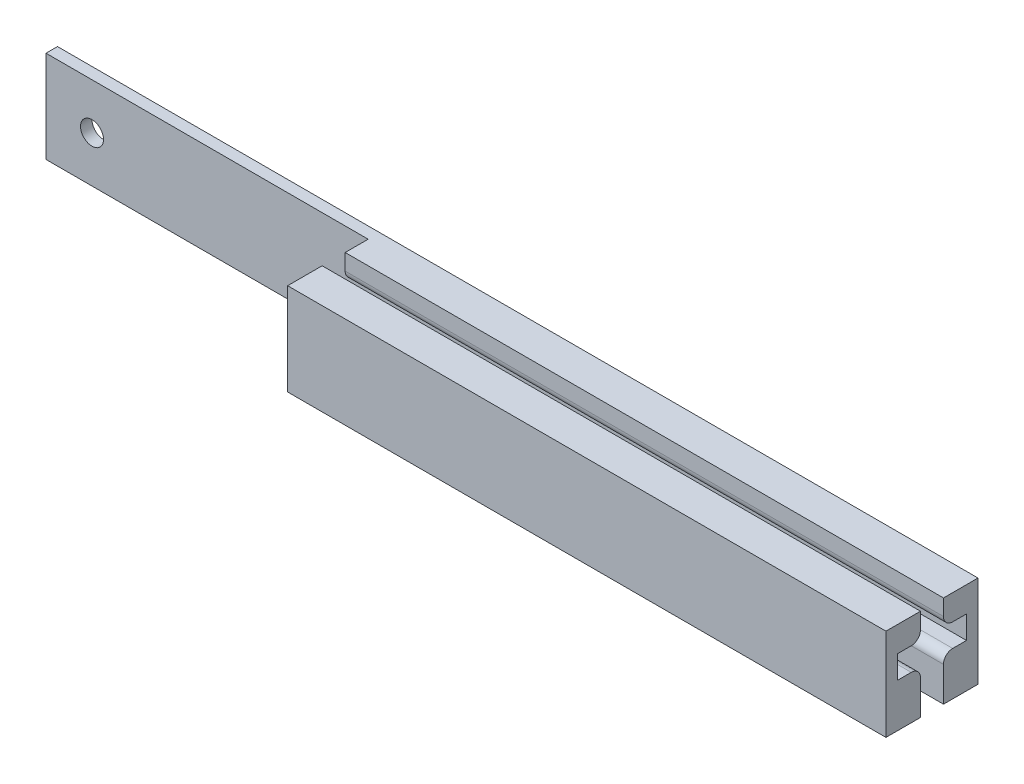
ISO-10303-21;
HEADER;
FILE_DESCRIPTION(('STEP AP214'),'2;1');
FILE_NAME('part.step','',(''),(''),'','','');
FILE_SCHEMA(('AUTOMOTIVE_DESIGN { 1 0 10303 214 1 1 1 1 }'));
ENDSEC;
DATA;
#1=APPLICATION_CONTEXT('core data for automotive mechanical design processes');
#2=APPLICATION_PROTOCOL_DEFINITION('international standard','automotive_design',2000,#1);
#3=PRODUCT_CONTEXT('',#1,'mechanical');
#4=PRODUCT('Part','Part','',(#3));
#5=PRODUCT_RELATED_PRODUCT_CATEGORY('part','',(#4));
#6=PRODUCT_DEFINITION_FORMATION('','',#4);
#7=PRODUCT_DEFINITION_CONTEXT('part definition',#1,'design');
#8=PRODUCT_DEFINITION('design','',#6,#7);
#9=PRODUCT_DEFINITION_SHAPE('','',#8);
#10=(LENGTH_UNIT() NAMED_UNIT(*) SI_UNIT(.MILLI.,.METRE.));
#11=(NAMED_UNIT(*) PLANE_ANGLE_UNIT() SI_UNIT($,.RADIAN.));
#12=(NAMED_UNIT(*) SI_UNIT($,.STERADIAN.) SOLID_ANGLE_UNIT());
#13=UNCERTAINTY_MEASURE_WITH_UNIT(LENGTH_MEASURE(1.E-05),#10,'distance_accuracy_value','');
#14=(GEOMETRIC_REPRESENTATION_CONTEXT(3) GLOBAL_UNCERTAINTY_ASSIGNED_CONTEXT((#13)) GLOBAL_UNIT_ASSIGNED_CONTEXT((#10,
#11,#12)) REPRESENTATION_CONTEXT('',''));
#15=CARTESIAN_POINT('',(0.,0.,0.));
#16=DIRECTION('',(0.,0.,1.));
#17=DIRECTION('',(1.,0.,0.));
#18=AXIS2_PLACEMENT_3D('',#15,#16,#17);
#19=CARTESIAN_POINT('',(0.,0.,0.));
#20=DIRECTION('',(1.,0.,0.));
#21=DIRECTION('',(0.,0.,-1.));
#22=AXIS2_PLACEMENT_3D('',#19,#20,#21);
#23=PLANE('',#22);
#24=DIRECTION('',(0.,1.,0.));
#25=VECTOR('',#24,1.);
#26=CARTESIAN_POINT('',(0.,0.,12.5));
#27=LINE('',#26,#25);
#28=CARTESIAN_POINT('',(0.,0.,12.5));
#29=VERTEX_POINT('',#28);
#30=CARTESIAN_POINT('',(0.,47.5,12.5));
#31=VERTEX_POINT('',#30);
#32=EDGE_CURVE('E52',#29,#31,#27,.T.);
#33=ORIENTED_EDGE('',*,*,#32,.F.);
#34=DIRECTION('',(0.,0.,1.));
#35=VECTOR('',#34,1.);
#36=CARTESIAN_POINT('',(0.,0.,0.));
#37=LINE('',#36,#35);
#38=CARTESIAN_POINT('',(0.,0.,100.));
#39=VERTEX_POINT('',#38);
#40=EDGE_CURVE('E238',#29,#39,#37,.T.);
#41=ORIENTED_EDGE('',*,*,#40,.T.);
#42=DIRECTION('',(0.,1.,0.));
#43=VECTOR('',#42,1.);
#44=CARTESIAN_POINT('',(0.,0.,100.));
#45=LINE('',#44,#43);
#46=CARTESIAN_POINT('',(0.,100.,100.));
#47=VERTEX_POINT('',#46);
#48=EDGE_CURVE('E340',#39,#47,#45,.T.);
#49=ORIENTED_EDGE('',*,*,#48,.T.);
#50=DIRECTION('',(0.,0.,1.));
#51=VECTOR('',#50,1.);
#52=CARTESIAN_POINT('',(0.,100.,0.));
#53=LINE('',#52,#51);
#54=CARTESIAN_POINT('',(0.,100.,62.5));
#55=VERTEX_POINT('',#54);
#56=EDGE_CURVE('E336',#55,#47,#53,.T.);
#57=ORIENTED_EDGE('',*,*,#56,.F.);
#58=DIRECTION('',(0.,-1.,0.));
#59=VECTOR('',#58,1.);
#60=CARTESIAN_POINT('',(0.,0.,62.5));
#61=LINE('',#60,#59);
#62=CARTESIAN_POINT('',(0.,82.5,62.5));
#63=VERTEX_POINT('',#62);
#64=EDGE_CURVE('E327',#55,#63,#61,.T.);
#65=ORIENTED_EDGE('',*,*,#64,.T.);
#66=CARTESIAN_POINT('',(0.,82.5,72.5));
#67=DIRECTION('',(1.,0.,0.));
#68=DIRECTION('',(0.,0.,-1.));
#69=AXIS2_PLACEMENT_3D('',#66,#67,#68);
#70=CIRCLE('',#69,10.);
#71=CARTESIAN_POINT('',(0.,72.5,72.5));
#72=VERTEX_POINT('',#71);
#73=EDGE_CURVE('E367',#63,#72,#70,.F.);
#74=ORIENTED_EDGE('',*,*,#73,.T.);
#75=DIRECTION('',(0.,0.,-1.));
#76=VECTOR('',#75,1.);
#77=CARTESIAN_POINT('',(0.,72.5,0.));
#78=LINE('',#77,#76);
#79=CARTESIAN_POINT('',(0.,72.5,87.5));
#80=VERTEX_POINT('',#79);
#81=EDGE_CURVE('E333',#80,#72,#78,.T.);
#82=ORIENTED_EDGE('',*,*,#81,.F.);
#83=DIRECTION('',(0.,-1.,0.));
#84=VECTOR('',#83,1.);
#85=CARTESIAN_POINT('',(0.,0.,87.5));
#86=LINE('',#85,#84);
#87=CARTESIAN_POINT('',(0.,47.5,87.5));
#88=VERTEX_POINT('',#87);
#89=EDGE_CURVE('E330',#80,#88,#86,.T.);
#90=ORIENTED_EDGE('',*,*,#89,.T.);
#91=DIRECTION('',(0.,0.,-1.));
#92=VECTOR('',#91,1.);
#93=CARTESIAN_POINT('',(0.,47.5,0.));
#94=LINE('',#93,#92);
#95=CARTESIAN_POINT('',(0.,47.5,72.5));
#96=VERTEX_POINT('',#95);
#97=EDGE_CURVE('E326',#88,#96,#94,.T.);
#98=ORIENTED_EDGE('',*,*,#97,.T.);
#99=CARTESIAN_POINT('',(0.,37.5,72.5));
#100=DIRECTION('',(1.,0.,0.));
#101=DIRECTION('',(0.,0.,-1.));
#102=AXIS2_PLACEMENT_3D('',#99,#100,#101);
#103=CIRCLE('',#102,10.);
#104=CARTESIAN_POINT('',(0.,37.5,62.5));
#105=VERTEX_POINT('',#104);
#106=EDGE_CURVE('E369',#96,#105,#103,.F.);
#107=ORIENTED_EDGE('',*,*,#106,.T.);
#108=CARTESIAN_POINT('',(0.,20.,62.5));
#109=VERTEX_POINT('',#108);
#110=EDGE_CURVE('E324',#105,#109,#61,.T.);
#111=ORIENTED_EDGE('',*,*,#110,.T.);
#112=DIRECTION('',(0.,0.,-1.));
#113=VECTOR('',#112,1.);
#114=CARTESIAN_POINT('',(0.,20.,0.));
#115=LINE('',#114,#113);
#116=CARTESIAN_POINT('',(0.,20.,37.5));
#117=VERTEX_POINT('',#116);
#118=EDGE_CURVE('E321',#109,#117,#115,.T.);
#119=ORIENTED_EDGE('',*,*,#118,.T.);
#120=DIRECTION('',(0.,-1.,0.));
#121=VECTOR('',#120,1.);
#122=CARTESIAN_POINT('',(0.,0.,37.5));
#123=LINE('',#122,#121);
#124=CARTESIAN_POINT('',(0.,37.5,37.5));
#125=VERTEX_POINT('',#124);
#126=EDGE_CURVE('E260',#125,#117,#123,.T.);
#127=ORIENTED_EDGE('',*,*,#126,.F.);
#128=CARTESIAN_POINT('',(0.,37.5,27.5));
#129=DIRECTION('',(1.,0.,0.));
#130=DIRECTION('',(0.,0.,-1.));
#131=AXIS2_PLACEMENT_3D('',#128,#129,#130);
#132=CIRCLE('',#131,10.);
#133=CARTESIAN_POINT('',(0.,47.5,27.5));
#134=VERTEX_POINT('',#133);
#135=EDGE_CURVE('E373',#125,#134,#132,.F.);
#136=ORIENTED_EDGE('',*,*,#135,.T.);
#137=DIRECTION('',(0.,0.,-1.));
#138=VECTOR('',#137,1.);
#139=CARTESIAN_POINT('',(0.,47.5,0.));
#140=LINE('',#139,#138);
#141=EDGE_CURVE('E248',#134,#31,#140,.T.);
#142=ORIENTED_EDGE('',*,*,#141,.T.);
#143=EDGE_LOOP('',(#33,#41,#49,#57,#65,#74,#82,#90,#98,#107,#111,#119,#127,#136,#142));
#144=FACE_BOUND('',#143,.T.);
#145=ADVANCED_FACE('F35',(#144),#23,.F.);
#146=CARTESIAN_POINT('',(0.,72.5,12.5));
#147=VERTEX_POINT('',#146);
#148=CARTESIAN_POINT('',(0.,100.,12.5));
#149=VERTEX_POINT('',#148);
#150=EDGE_CURVE('E11',#147,#149,#27,.T.);
#151=ORIENTED_EDGE('',*,*,#150,.F.);
#152=DIRECTION('',(0.,0.,-1.));
#153=VECTOR('',#152,1.);
#154=CARTESIAN_POINT('',(0.,72.5,0.));
#155=LINE('',#154,#153);
#156=CARTESIAN_POINT('',(0.,72.5,27.5));
#157=VERTEX_POINT('',#156);
#158=EDGE_CURVE('E245',#157,#147,#155,.T.);
#159=ORIENTED_EDGE('',*,*,#158,.F.);
#160=CARTESIAN_POINT('',(0.,82.5,27.5));
#161=DIRECTION('',(1.,0.,0.));
#162=DIRECTION('',(0.,0.,-1.));
#163=AXIS2_PLACEMENT_3D('',#160,#161,#162);
#164=CIRCLE('',#163,10.);
#165=CARTESIAN_POINT('',(0.,82.5,37.5));
#166=VERTEX_POINT('',#165);
#167=EDGE_CURVE('E371',#157,#166,#164,.F.);
#168=ORIENTED_EDGE('',*,*,#167,.T.);
#169=CARTESIAN_POINT('',(0.,100.,37.5));
#170=VERTEX_POINT('',#169);
#171=EDGE_CURVE('E290',#170,#166,#123,.T.);
#172=ORIENTED_EDGE('',*,*,#171,.F.);
#173=EDGE_CURVE('E341',#149,#170,#53,.T.);
#174=ORIENTED_EDGE('',*,*,#173,.F.);
#175=EDGE_LOOP('',(#151,#159,#168,#172,#174));
#176=FACE_BOUND('',#175,.T.);
#177=ADVANCED_FACE('F490',(#176),#23,.F.);
#178=CARTESIAN_POINT('',(650.,0.,0.));
#179=DIRECTION('',(1.,0.,0.));
#180=DIRECTION('',(0.,0.,-1.));
#181=AXIS2_PLACEMENT_3D('',#178,#179,#180);
#182=PLANE('',#181);
#183=DIRECTION('',(0.,0.,-1.));
#184=VECTOR('',#183,1.);
#185=CARTESIAN_POINT('',(650.,72.5,0.));
#186=LINE('',#185,#184);
#187=CARTESIAN_POINT('',(650.,72.5,87.5));
#188=VERTEX_POINT('',#187);
#189=CARTESIAN_POINT('',(650.,72.5,72.5));
#190=VERTEX_POINT('',#189);
#191=EDGE_CURVE('E307',#188,#190,#186,.T.);
#192=ORIENTED_EDGE('',*,*,#191,.T.);
#193=CARTESIAN_POINT('',(650.,82.5,72.5));
#194=DIRECTION('',(1.,0.,0.));
#195=DIRECTION('',(0.,0.,-1.));
#196=AXIS2_PLACEMENT_3D('',#193,#194,#195);
#197=CIRCLE('',#196,10.);
#198=CARTESIAN_POINT('',(650.,82.5,62.5));
#199=VERTEX_POINT('',#198);
#200=EDGE_CURVE('E361',#190,#199,#197,.T.);
#201=ORIENTED_EDGE('',*,*,#200,.T.);
#202=DIRECTION('',(0.,-1.,0.));
#203=VECTOR('',#202,1.);
#204=CARTESIAN_POINT('',(650.,0.,62.5));
#205=LINE('',#204,#203);
#206=CARTESIAN_POINT('',(650.,100.,62.5));
#207=VERTEX_POINT('',#206);
#208=EDGE_CURVE('E301',#207,#199,#205,.T.);
#209=ORIENTED_EDGE('',*,*,#208,.F.);
#210=DIRECTION('',(0.,0.,1.));
#211=VECTOR('',#210,1.);
#212=CARTESIAN_POINT('',(650.,100.,0.));
#213=LINE('',#212,#211);
#214=CARTESIAN_POINT('',(650.,100.,100.));
#215=VERTEX_POINT('',#214);
#216=EDGE_CURVE('E310',#207,#215,#213,.T.);
#217=ORIENTED_EDGE('',*,*,#216,.T.);
#218=DIRECTION('',(0.,1.,0.));
#219=VECTOR('',#218,1.);
#220=CARTESIAN_POINT('',(650.,0.,100.));
#221=LINE('',#220,#219);
#222=CARTESIAN_POINT('',(650.,0.,100.));
#223=VERTEX_POINT('',#222);
#224=EDGE_CURVE('E312',#223,#215,#221,.T.);
#225=ORIENTED_EDGE('',*,*,#224,.F.);
#226=DIRECTION('',(0.,0.,1.));
#227=VECTOR('',#226,1.);
#228=CARTESIAN_POINT('',(650.,0.,0.));
#229=LINE('',#228,#227);
#230=CARTESIAN_POINT('',(650.,0.,62.5));
#231=VERTEX_POINT('',#230);
#232=EDGE_CURVE('E316',#231,#223,#229,.T.);
#233=ORIENTED_EDGE('',*,*,#232,.F.);
#234=CARTESIAN_POINT('',(650.,37.5,62.5));
#235=VERTEX_POINT('',#234);
#236=EDGE_CURVE('E297',#235,#231,#205,.T.);
#237=ORIENTED_EDGE('',*,*,#236,.F.);
#238=CARTESIAN_POINT('',(650.,37.5,72.5));
#239=DIRECTION('',(1.,0.,0.));
#240=DIRECTION('',(0.,0.,-1.));
#241=AXIS2_PLACEMENT_3D('',#238,#239,#240);
#242=CIRCLE('',#241,10.);
#243=CARTESIAN_POINT('',(650.,47.5,72.5));
#244=VERTEX_POINT('',#243);
#245=EDGE_CURVE('E363',#235,#244,#242,.T.);
#246=ORIENTED_EDGE('',*,*,#245,.T.);
#247=DIRECTION('',(0.,0.,-1.));
#248=VECTOR('',#247,1.);
#249=CARTESIAN_POINT('',(650.,47.5,0.));
#250=LINE('',#249,#248);
#251=CARTESIAN_POINT('',(650.,47.5,87.5));
#252=VERTEX_POINT('',#251);
#253=EDGE_CURVE('E300',#252,#244,#250,.T.);
#254=ORIENTED_EDGE('',*,*,#253,.F.);
#255=DIRECTION('',(0.,-1.,0.));
#256=VECTOR('',#255,1.);
#257=CARTESIAN_POINT('',(650.,0.,87.5));
#258=LINE('',#257,#256);
#259=EDGE_CURVE('E304',#188,#252,#258,.T.);
#260=ORIENTED_EDGE('',*,*,#259,.F.);
#261=EDGE_LOOP('',(#192,#201,#209,#217,#225,#233,#237,#246,#254,#260));
#262=FACE_BOUND('',#261,.T.);
#263=ADVANCED_FACE('F445',(#262),#182,.T.);
#264=CARTESIAN_POINT('',(650.,72.5,0.));
#265=DIRECTION('',(0.,1.,0.));
#266=DIRECTION('',(0.,0.,1.));
#267=AXIS2_PLACEMENT_3D('',#264,#265,#266);
#268=PLANE('',#267);
#269=DIRECTION('',(0.,0.,-1.));
#270=VECTOR('',#269,1.);
#271=CARTESIAN_POINT('',(650.,72.5,0.));
#272=LINE('',#271,#270);
#273=CARTESIAN_POINT('',(650.,72.5,27.5));
#274=VERTEX_POINT('',#273);
#275=CARTESIAN_POINT('',(650.,72.5,12.5));
#276=VERTEX_POINT('',#275);
#277=EDGE_CURVE('E287',#274,#276,#272,.T.);
#278=ORIENTED_EDGE('',*,*,#277,.F.);
#279=DIRECTION('',(-1.,0.,0.));
#280=VECTOR('',#279,1.);
#281=CARTESIAN_POINT('',(650.,72.5,27.5));
#282=LINE('',#281,#280);
#283=EDGE_CURVE('E353',#274,#157,#282,.T.);
#284=ORIENTED_EDGE('',*,*,#283,.T.);
#285=ORIENTED_EDGE('',*,*,#158,.T.);
#286=DIRECTION('',(-1.,0.,0.));
#287=VECTOR('',#286,1.);
#288=CARTESIAN_POINT('',(650.,72.5,12.5));
#289=LINE('',#288,#287);
#290=EDGE_CURVE('E252',#276,#147,#289,.T.);
#291=ORIENTED_EDGE('',*,*,#290,.F.);
#292=EDGE_LOOP('',(#278,#284,#285,#291));
#293=FACE_BOUND('',#292,.T.);
#294=ADVANCED_FACE('F417',(#293),#268,.F.);
#295=CARTESIAN_POINT('',(650.,0.,12.5));
#296=DIRECTION('',(0.,0.,-1.));
#297=DIRECTION('',(0.,1.,0.));
#298=AXIS2_PLACEMENT_3D('',#295,#296,#297);
#299=PLANE('',#298);
#300=CARTESIAN_POINT('',(-300.,50.,12.5));
#301=DIRECTION('',(0.,0.,1.));
#302=DIRECTION('',(1.,0.,0.));
#303=AXIS2_PLACEMENT_3D('',#300,#301,#302);
#304=CIRCLE('',#303,12.5);
#305=CARTESIAN_POINT('',(-287.5,50.,12.5));
#306=VERTEX_POINT('',#305);
#307=EDGE_CURVE('E228',#306,#306,#304,.T.);
#308=ORIENTED_EDGE('',*,*,#307,.F.);
#309=EDGE_LOOP('',(#308));
#310=FACE_BOUND('',#309,.T.);
#311=ORIENTED_EDGE('',*,*,#290,.T.);
#312=ORIENTED_EDGE('',*,*,#150,.T.);
#313=DIRECTION('',(1.,0.,0.));
#314=VECTOR('',#313,1.);
#315=CARTESIAN_POINT('',(-350.,100.,12.5));
#316=LINE('',#315,#314);
#317=CARTESIAN_POINT('',(-350.,100.,12.5));
#318=VERTEX_POINT('',#317);
#319=EDGE_CURVE('E232',#318,#149,#316,.T.);
#320=ORIENTED_EDGE('',*,*,#319,.F.);
#321=DIRECTION('',(0.,1.,0.));
#322=VECTOR('',#321,1.);
#323=CARTESIAN_POINT('',(-350.,0.,12.5));
#324=LINE('',#323,#322);
#325=CARTESIAN_POINT('',(-350.,0.,12.5));
#326=VERTEX_POINT('',#325);
#327=EDGE_CURVE('E219',#326,#318,#324,.T.);
#328=ORIENTED_EDGE('',*,*,#327,.F.);
#329=DIRECTION('',(1.,0.,0.));
#330=VECTOR('',#329,1.);
#331=CARTESIAN_POINT('',(-350.,0.,12.5));
#332=LINE('',#331,#330);
#333=EDGE_CURVE('E216',#326,#29,#332,.T.);
#334=ORIENTED_EDGE('',*,*,#333,.T.);
#335=ORIENTED_EDGE('',*,*,#32,.T.);
#336=DIRECTION('',(-1.,0.,0.));
#337=VECTOR('',#336,1.);
#338=CARTESIAN_POINT('',(650.,47.5,12.5));
#339=LINE('',#338,#337);
#340=CARTESIAN_POINT('',(650.,47.5,12.5));
#341=VERTEX_POINT('',#340);
#342=EDGE_CURVE('E256',#341,#31,#339,.T.);
#343=ORIENTED_EDGE('',*,*,#342,.F.);
#344=DIRECTION('',(0.,-1.,0.));
#345=VECTOR('',#344,1.);
#346=CARTESIAN_POINT('',(650.,0.,12.5));
#347=LINE('',#346,#345);
#348=EDGE_CURVE('E289',#276,#341,#347,.T.);
#349=ORIENTED_EDGE('',*,*,#348,.F.);
#350=EDGE_LOOP('',(#311,#312,#320,#328,#334,#335,#343,#349));
#351=FACE_BOUND('',#350,.T.);
#352=ADVANCED_FACE('F419',(#310,#351),#299,.F.);
#353=CARTESIAN_POINT('',(650.,47.5,0.));
#354=DIRECTION('',(0.,1.,0.));
#355=DIRECTION('',(0.,0.,1.));
#356=AXIS2_PLACEMENT_3D('',#353,#354,#355);
#357=PLANE('',#356);
#358=ORIENTED_EDGE('',*,*,#141,.F.);
#359=DIRECTION('',(-1.,0.,0.));
#360=VECTOR('',#359,1.);
#361=CARTESIAN_POINT('',(650.,47.5,27.5));
#362=LINE('',#361,#360);
#363=CARTESIAN_POINT('',(650.,47.5,27.5));
#364=VERTEX_POINT('',#363);
#365=EDGE_CURVE('E44',#134,#364,#362,.F.);
#366=ORIENTED_EDGE('',*,*,#365,.T.);
#367=DIRECTION('',(0.,0.,-1.));
#368=VECTOR('',#367,1.);
#369=CARTESIAN_POINT('',(650.,47.5,0.));
#370=LINE('',#369,#368);
#371=EDGE_CURVE('E293',#364,#341,#370,.T.);
#372=ORIENTED_EDGE('',*,*,#371,.T.);
#373=ORIENTED_EDGE('',*,*,#342,.T.);
#374=EDGE_LOOP('',(#358,#366,#372,#373));
#375=FACE_BOUND('',#374,.T.);
#376=ADVANCED_FACE('F522',(#375),#357,.T.);
#377=CARTESIAN_POINT('',(650.,0.,37.5));
#378=DIRECTION('',(0.,0.,-1.));
#379=DIRECTION('',(0.,1.,0.));
#380=AXIS2_PLACEMENT_3D('',#377,#378,#379);
#381=PLANE('',#380);
#382=DIRECTION('',(0.,-1.,0.));
#383=VECTOR('',#382,1.);
#384=CARTESIAN_POINT('',(650.,0.,37.5));
#385=LINE('',#384,#383);
#386=CARTESIAN_POINT('',(650.,37.5,37.5));
#387=VERTEX_POINT('',#386);
#388=CARTESIAN_POINT('',(650.,0.,37.5));
#389=VERTEX_POINT('',#388);
#390=EDGE_CURVE('E295',#387,#389,#385,.T.);
#391=ORIENTED_EDGE('',*,*,#390,.F.);
#392=DIRECTION('',(-1.,0.,0.));
#393=VECTOR('',#392,1.);
#394=CARTESIAN_POINT('',(0.,37.5,37.5));
#395=LINE('',#394,#393);
#396=EDGE_CURVE('E344',#387,#125,#395,.T.);
#397=ORIENTED_EDGE('',*,*,#396,.T.);
#398=ORIENTED_EDGE('',*,*,#126,.T.);
#399=DIRECTION('',(-1.,0.,0.));
#400=VECTOR('',#399,1.);
#401=CARTESIAN_POINT('',(650.,20.,37.5));
#402=LINE('',#401,#400);
#403=CARTESIAN_POINT('',(50.,20.,37.5));
#404=VERTEX_POINT('',#403);
#405=EDGE_CURVE('E265',#404,#117,#402,.T.);
#406=ORIENTED_EDGE('',*,*,#405,.F.);
#407=DIRECTION('',(0.,-1.,0.));
#408=VECTOR('',#407,1.);
#409=CARTESIAN_POINT('',(50.,800.,37.5000000000001));
#410=LINE('',#409,#408);
#411=CARTESIAN_POINT('',(50.,0.,37.5));
#412=VERTEX_POINT('',#411);
#413=EDGE_CURVE('E282',#404,#412,#410,.T.);
#414=ORIENTED_EDGE('',*,*,#413,.T.);
#415=DIRECTION('',(1.,0.,0.));
#416=VECTOR('',#415,1.);
#417=CARTESIAN_POINT('',(50.,0.,37.5));
#418=LINE('',#417,#416);
#419=EDGE_CURVE('E272',#412,#389,#418,.T.);
#420=ORIENTED_EDGE('',*,*,#419,.T.);
#421=EDGE_LOOP('',(#391,#397,#398,#406,#414,#420));
#422=FACE_BOUND('',#421,.T.);
#423=ADVANCED_FACE('F428',(#422),#381,.F.);
#424=CARTESIAN_POINT('',(650.,20.,0.));
#425=DIRECTION('',(0.,1.,0.));
#426=DIRECTION('',(0.,0.,1.));
#427=AXIS2_PLACEMENT_3D('',#424,#425,#426);
#428=PLANE('',#427);
#429=DIRECTION('',(0.,0.,1.));
#430=VECTOR('',#429,1.);
#431=CARTESIAN_POINT('',(49.9999999999999,20.,-3.33066907387547E-13));
#432=LINE('',#431,#430);
#433=CARTESIAN_POINT('',(50.,20.,62.5));
#434=VERTEX_POINT('',#433);
#435=EDGE_CURVE('E249',#404,#434,#432,.T.);
#436=ORIENTED_EDGE('',*,*,#435,.F.);
#437=ORIENTED_EDGE('',*,*,#405,.T.);
#438=ORIENTED_EDGE('',*,*,#118,.F.);
#439=DIRECTION('',(-1.,0.,0.));
#440=VECTOR('',#439,1.);
#441=CARTESIAN_POINT('',(650.,20.,62.5));
#442=LINE('',#441,#440);
#443=EDGE_CURVE('E379',#434,#109,#442,.T.);
#444=ORIENTED_EDGE('',*,*,#443,.F.);
#445=EDGE_LOOP('',(#436,#437,#438,#444));
#446=FACE_BOUND('',#445,.T.);
#447=ADVANCED_FACE('F435',(#446),#428,.T.);
#448=CARTESIAN_POINT('',(650.,0.,62.5));
#449=DIRECTION('',(0.,0.,-1.));
#450=DIRECTION('',(0.,1.,0.));
#451=AXIS2_PLACEMENT_3D('',#448,#449,#450);
#452=PLANE('',#451);
#453=ORIENTED_EDGE('',*,*,#110,.F.);
#454=DIRECTION('',(-1.,0.,0.));
#455=VECTOR('',#454,1.);
#456=CARTESIAN_POINT('',(650.,37.5,62.5));
#457=LINE('',#456,#455);
#458=EDGE_CURVE('E356',#105,#235,#457,.F.);
#459=ORIENTED_EDGE('',*,*,#458,.T.);
#460=ORIENTED_EDGE('',*,*,#236,.T.);
#461=DIRECTION('',(-1.,0.,0.));
#462=VECTOR('',#461,1.);
#463=CARTESIAN_POINT('',(50.,0.,62.5));
#464=LINE('',#463,#462);
#465=CARTESIAN_POINT('',(50.,0.,62.5));
#466=VERTEX_POINT('',#465);
#467=EDGE_CURVE('E277',#231,#466,#464,.T.);
#468=ORIENTED_EDGE('',*,*,#467,.T.);
#469=DIRECTION('',(0.,-1.,0.));
#470=VECTOR('',#469,1.);
#471=CARTESIAN_POINT('',(50.,800.,62.5000000000001));
#472=LINE('',#471,#470);
#473=EDGE_CURVE('E283',#434,#466,#472,.T.);
#474=ORIENTED_EDGE('',*,*,#473,.F.);
#475=ORIENTED_EDGE('',*,*,#443,.T.);
#476=EDGE_LOOP('',(#453,#459,#460,#468,#474,#475));
#477=FACE_BOUND('',#476,.T.);
#478=ADVANCED_FACE('F439',(#477),#452,.T.);
#479=CARTESIAN_POINT('',(650.,47.5,0.));
#480=DIRECTION('',(0.,1.,0.));
#481=DIRECTION('',(0.,0.,1.));
#482=AXIS2_PLACEMENT_3D('',#479,#480,#481);
#483=PLANE('',#482);
#484=ORIENTED_EDGE('',*,*,#253,.T.);
#485=DIRECTION('',(-1.,0.,0.));
#486=VECTOR('',#485,1.);
#487=CARTESIAN_POINT('',(650.,47.5,72.5));
#488=LINE('',#487,#486);
#489=EDGE_CURVE('E358',#244,#96,#488,.T.);
#490=ORIENTED_EDGE('',*,*,#489,.T.);
#491=ORIENTED_EDGE('',*,*,#97,.F.);
#492=DIRECTION('',(-1.,0.,0.));
#493=VECTOR('',#492,1.);
#494=CARTESIAN_POINT('',(650.,47.5,87.5));
#495=LINE('',#494,#493);
#496=EDGE_CURVE('E382',#252,#88,#495,.T.);
#497=ORIENTED_EDGE('',*,*,#496,.F.);
#498=EDGE_LOOP('',(#484,#490,#491,#497));
#499=FACE_BOUND('',#498,.T.);
#500=ADVANCED_FACE('F476',(#499),#483,.T.);
#501=CARTESIAN_POINT('',(650.,0.,87.5));
#502=DIRECTION('',(0.,0.,-1.));
#503=DIRECTION('',(-1.,0.,0.));
#504=AXIS2_PLACEMENT_3D('',#501,#502,#503);
#505=PLANE('',#504);
#506=ORIENTED_EDGE('',*,*,#89,.F.);
#507=DIRECTION('',(-1.,0.,0.));
#508=VECTOR('',#507,1.);
#509=CARTESIAN_POINT('',(650.,72.5,87.5));
#510=LINE('',#509,#508);
#511=EDGE_CURVE('E384',#188,#80,#510,.T.);
#512=ORIENTED_EDGE('',*,*,#511,.F.);
#513=ORIENTED_EDGE('',*,*,#259,.T.);
#514=ORIENTED_EDGE('',*,*,#496,.T.);
#515=EDGE_LOOP('',(#506,#512,#513,#514));
#516=FACE_BOUND('',#515,.T.);
#517=ADVANCED_FACE('F473',(#516),#505,.T.);
#518=CARTESIAN_POINT('',(650.,72.5,0.));
#519=DIRECTION('',(0.,1.,0.));
#520=DIRECTION('',(0.,0.,1.));
#521=AXIS2_PLACEMENT_3D('',#518,#519,#520);
#522=PLANE('',#521);
#523=ORIENTED_EDGE('',*,*,#81,.T.);
#524=DIRECTION('',(-1.,0.,0.));
#525=VECTOR('',#524,1.);
#526=CARTESIAN_POINT('',(650.,72.5,72.5));
#527=LINE('',#526,#525);
#528=EDGE_CURVE('E365',#72,#190,#527,.F.);
#529=ORIENTED_EDGE('',*,*,#528,.T.);
#530=ORIENTED_EDGE('',*,*,#191,.F.);
#531=ORIENTED_EDGE('',*,*,#511,.T.);
#532=EDGE_LOOP('',(#523,#529,#530,#531));
#533=FACE_BOUND('',#532,.T.);
#534=ADVANCED_FACE('F469',(#533),#522,.F.);
#535=ORIENTED_EDGE('',*,*,#208,.T.);
#536=DIRECTION('',(-1.,0.,0.));
#537=VECTOR('',#536,1.);
#538=CARTESIAN_POINT('',(0.,82.5,62.5));
#539=LINE('',#538,#537);
#540=EDGE_CURVE('E255',#199,#63,#539,.T.);
#541=ORIENTED_EDGE('',*,*,#540,.T.);
#542=ORIENTED_EDGE('',*,*,#64,.F.);
#543=DIRECTION('',(-1.,0.,0.));
#544=VECTOR('',#543,1.);
#545=CARTESIAN_POINT('',(650.,100.,62.5));
#546=LINE('',#545,#544);
#547=EDGE_CURVE('E386',#207,#55,#546,.T.);
#548=ORIENTED_EDGE('',*,*,#547,.F.);
#549=EDGE_LOOP('',(#535,#541,#542,#548));
#550=FACE_BOUND('',#549,.T.);
#551=ADVANCED_FACE('F460',(#550),#452,.T.);
#552=CARTESIAN_POINT('',(650.,100.,0.));
#553=DIRECTION('',(0.,-1.,0.));
#554=DIRECTION('',(0.,0.,-1.));
#555=AXIS2_PLACEMENT_3D('',#552,#553,#554);
#556=PLANE('',#555);
#557=ORIENTED_EDGE('',*,*,#56,.T.);
#558=DIRECTION('',(-1.,0.,0.));
#559=VECTOR('',#558,1.);
#560=CARTESIAN_POINT('',(650.,100.,100.));
#561=LINE('',#560,#559);
#562=EDGE_CURVE('E388',#215,#47,#561,.T.);
#563=ORIENTED_EDGE('',*,*,#562,.F.);
#564=ORIENTED_EDGE('',*,*,#216,.F.);
#565=ORIENTED_EDGE('',*,*,#547,.T.);
#566=EDGE_LOOP('',(#557,#563,#564,#565));
#567=FACE_BOUND('',#566,.T.);
#568=ADVANCED_FACE('F504',(#567),#556,.F.);
#569=CARTESIAN_POINT('',(650.,0.,100.));
#570=DIRECTION('',(0.,0.,1.));
#571=DIRECTION('',(1.,0.,0.));
#572=AXIS2_PLACEMENT_3D('',#569,#570,#571);
#573=PLANE('',#572);
#574=ORIENTED_EDGE('',*,*,#48,.F.);
#575=DIRECTION('',(-1.,0.,0.));
#576=VECTOR('',#575,1.);
#577=CARTESIAN_POINT('',(650.,0.,100.));
#578=LINE('',#577,#576);
#579=EDGE_CURVE('E208',#223,#39,#578,.T.);
#580=ORIENTED_EDGE('',*,*,#579,.F.);
#581=ORIENTED_EDGE('',*,*,#224,.T.);
#582=ORIENTED_EDGE('',*,*,#562,.T.);
#583=EDGE_LOOP('',(#574,#580,#581,#582));
#584=FACE_BOUND('',#583,.T.);
#585=ADVANCED_FACE('F452',(#584),#573,.T.);
#586=CARTESIAN_POINT('',(650.,0.,0.));
#587=DIRECTION('',(0.,-1.,0.));
#588=DIRECTION('',(0.,0.,-1.));
#589=AXIS2_PLACEMENT_3D('',#586,#587,#588);
#590=PLANE('',#589);
#591=ORIENTED_EDGE('',*,*,#467,.F.);
#592=ORIENTED_EDGE('',*,*,#232,.T.);
#593=ORIENTED_EDGE('',*,*,#579,.T.);
#594=ORIENTED_EDGE('',*,*,#40,.F.);
#595=ORIENTED_EDGE('',*,*,#333,.F.);
#596=DIRECTION('',(0.,0.,1.));
#597=VECTOR('',#596,1.);
#598=CARTESIAN_POINT('',(-350.,0.,0.));
#599=LINE('',#598,#597);
#600=CARTESIAN_POINT('',(-350.,0.,0.));
#601=VERTEX_POINT('',#600);
#602=EDGE_CURVE('E212',#601,#326,#599,.T.);
#603=ORIENTED_EDGE('',*,*,#602,.F.);
#604=DIRECTION('',(-1.,0.,0.));
#605=VECTOR('',#604,1.);
#606=CARTESIAN_POINT('',(650.,0.,0.));
#607=LINE('',#606,#605);
#608=CARTESIAN_POINT('',(650.,0.,0.));
#609=VERTEX_POINT('',#608);
#610=EDGE_CURVE('E198',#609,#601,#607,.T.);
#611=ORIENTED_EDGE('',*,*,#610,.F.);
#612=EDGE_CURVE('E317',#609,#389,#229,.T.);
#613=ORIENTED_EDGE('',*,*,#612,.T.);
#614=ORIENTED_EDGE('',*,*,#419,.F.);
#615=DIRECTION('',(0.,0.,-1.));
#616=VECTOR('',#615,1.);
#617=CARTESIAN_POINT('',(50.,0.,62.5));
#618=LINE('',#617,#616);
#619=EDGE_CURVE('E268',#466,#412,#618,.T.);
#620=ORIENTED_EDGE('',*,*,#619,.F.);
#621=EDGE_LOOP('',(#591,#592,#593,#594,#595,#603,#611,#613,#614,#620));
#622=FACE_BOUND('',#621,.T.);
#623=ADVANCED_FACE('F214',(#622),#590,.T.);
#624=CARTESIAN_POINT('',(650.,0.,0.));
#625=DIRECTION('',(0.,0.,1.));
#626=DIRECTION('',(1.,0.,0.));
#627=AXIS2_PLACEMENT_3D('',#624,#625,#626);
#628=PLANE('',#627);
#629=CARTESIAN_POINT('',(-300.,50.,0.));
#630=DIRECTION('',(0.,0.,1.));
#631=DIRECTION('',(1.,0.,0.));
#632=AXIS2_PLACEMENT_3D('',#629,#630,#631);
#633=CIRCLE('',#632,12.5);
#634=CARTESIAN_POINT('',(-287.5,50.,0.));
#635=VERTEX_POINT('',#634);
#636=EDGE_CURVE('E39',#635,#635,#633,.T.);
#637=ORIENTED_EDGE('',*,*,#636,.T.);
#638=EDGE_LOOP('',(#637));
#639=FACE_BOUND('',#638,.T.);
#640=ORIENTED_EDGE('',*,*,#610,.T.);
#641=DIRECTION('',(0.,-1.,0.));
#642=VECTOR('',#641,1.);
#643=CARTESIAN_POINT('',(-350.,0.,0.));
#644=LINE('',#643,#642);
#645=CARTESIAN_POINT('',(-350.,100.,0.));
#646=VERTEX_POINT('',#645);
#647=EDGE_CURVE('E203',#646,#601,#644,.T.);
#648=ORIENTED_EDGE('',*,*,#647,.F.);
#649=DIRECTION('',(-1.,0.,0.));
#650=VECTOR('',#649,1.);
#651=CARTESIAN_POINT('',(650.,100.,0.));
#652=LINE('',#651,#650);
#653=CARTESIAN_POINT('',(650.,100.,0.));
#654=VERTEX_POINT('',#653);
#655=EDGE_CURVE('E209',#654,#646,#652,.T.);
#656=ORIENTED_EDGE('',*,*,#655,.F.);
#657=DIRECTION('',(0.,1.,0.));
#658=VECTOR('',#657,1.);
#659=CARTESIAN_POINT('',(650.,0.,0.));
#660=LINE('',#659,#658);
#661=EDGE_CURVE('E204',#609,#654,#660,.T.);
#662=ORIENTED_EDGE('',*,*,#661,.F.);
#663=EDGE_LOOP('',(#640,#648,#656,#662));
#664=FACE_BOUND('',#663,.T.);
#665=ADVANCED_FACE('F200',(#639,#664),#628,.F.);
#666=ORIENTED_EDGE('',*,*,#655,.T.);
#667=DIRECTION('',(0.,0.,-1.));
#668=VECTOR('',#667,1.);
#669=CARTESIAN_POINT('',(-350.,100.,0.));
#670=LINE('',#669,#668);
#671=EDGE_CURVE('E224',#318,#646,#670,.T.);
#672=ORIENTED_EDGE('',*,*,#671,.F.);
#673=ORIENTED_EDGE('',*,*,#319,.T.);
#674=ORIENTED_EDGE('',*,*,#173,.T.);
#675=DIRECTION('',(-1.,0.,0.));
#676=VECTOR('',#675,1.);
#677=CARTESIAN_POINT('',(650.,100.,37.5));
#678=LINE('',#677,#676);
#679=CARTESIAN_POINT('',(650.,100.,37.5));
#680=VERTEX_POINT('',#679);
#681=EDGE_CURVE('E393',#680,#170,#678,.T.);
#682=ORIENTED_EDGE('',*,*,#681,.F.);
#683=EDGE_CURVE('E313',#654,#680,#213,.T.);
#684=ORIENTED_EDGE('',*,*,#683,.F.);
#685=EDGE_LOOP('',(#666,#672,#673,#674,#682,#684));
#686=FACE_BOUND('',#685,.T.);
#687=ADVANCED_FACE('F407',(#686),#556,.F.);
#688=ORIENTED_EDGE('',*,*,#171,.T.);
#689=DIRECTION('',(-1.,0.,0.));
#690=VECTOR('',#689,1.);
#691=CARTESIAN_POINT('',(650.,82.5,37.5));
#692=LINE('',#691,#690);
#693=CARTESIAN_POINT('',(650.,82.5,37.5));
#694=VERTEX_POINT('',#693);
#695=EDGE_CURVE('E351',#166,#694,#692,.F.);
#696=ORIENTED_EDGE('',*,*,#695,.T.);
#697=EDGE_CURVE('E298',#680,#694,#385,.T.);
#698=ORIENTED_EDGE('',*,*,#697,.F.);
#699=ORIENTED_EDGE('',*,*,#681,.T.);
#700=EDGE_LOOP('',(#688,#696,#698,#699));
#701=FACE_BOUND('',#700,.T.);
#702=ADVANCED_FACE('F408',(#701),#381,.F.);
#703=ORIENTED_EDGE('',*,*,#697,.T.);
#704=CARTESIAN_POINT('',(650.,82.5,27.5));
#705=DIRECTION('',(1.,0.,0.));
#706=DIRECTION('',(0.,0.,-1.));
#707=AXIS2_PLACEMENT_3D('',#704,#705,#706);
#708=CIRCLE('',#707,10.);
#709=EDGE_CURVE('E347',#694,#274,#708,.T.);
#710=ORIENTED_EDGE('',*,*,#709,.T.);
#711=ORIENTED_EDGE('',*,*,#277,.T.);
#712=ORIENTED_EDGE('',*,*,#348,.T.);
#713=ORIENTED_EDGE('',*,*,#371,.F.);
#714=CARTESIAN_POINT('',(650.,37.5,27.5));
#715=DIRECTION('',(1.,0.,0.));
#716=DIRECTION('',(0.,0.,-1.));
#717=AXIS2_PLACEMENT_3D('',#714,#715,#716);
#718=CIRCLE('',#717,10.);
#719=EDGE_CURVE('E349',#364,#387,#718,.T.);
#720=ORIENTED_EDGE('',*,*,#719,.T.);
#721=ORIENTED_EDGE('',*,*,#390,.T.);
#722=ORIENTED_EDGE('',*,*,#612,.F.);
#723=ORIENTED_EDGE('',*,*,#661,.T.);
#724=ORIENTED_EDGE('',*,*,#683,.T.);
#725=EDGE_LOOP('',(#703,#710,#711,#712,#713,#720,#721,#722,#723,#724));
#726=FACE_BOUND('',#725,.T.);
#727=ADVANCED_FACE('F405',(#726),#182,.T.);
#728=CARTESIAN_POINT('',(50.,800.,62.5000000000001));
#729=DIRECTION('',(-1.,0.,0.));
#730=DIRECTION('',(0.,0.,1.));
#731=AXIS2_PLACEMENT_3D('',#728,#729,#730);
#732=PLANE('',#731);
#733=ORIENTED_EDGE('',*,*,#435,.T.);
#734=ORIENTED_EDGE('',*,*,#473,.T.);
#735=ORIENTED_EDGE('',*,*,#619,.T.);
#736=ORIENTED_EDGE('',*,*,#413,.F.);
#737=EDGE_LOOP('',(#733,#734,#735,#736));
#738=FACE_BOUND('',#737,.T.);
#739=ADVANCED_FACE('F436',(#738),#732,.F.);
#740=CARTESIAN_POINT('',(650.,82.5,72.5));
#741=DIRECTION('',(1.,0.,0.));
#742=DIRECTION('',(0.,0.,-1.));
#743=AXIS2_PLACEMENT_3D('',#740,#741,#742);
#744=CYLINDRICAL_SURFACE('',#743,10.);
#745=ORIENTED_EDGE('',*,*,#200,.F.);
#746=ORIENTED_EDGE('',*,*,#528,.F.);
#747=ORIENTED_EDGE('',*,*,#73,.F.);
#748=ORIENTED_EDGE('',*,*,#540,.F.);
#749=EDGE_LOOP('',(#745,#746,#747,#748));
#750=FACE_BOUND('',#749,.T.);
#751=ADVANCED_FACE('F464',(#750),#744,.T.);
#752=CARTESIAN_POINT('',(650.,37.5,72.5));
#753=DIRECTION('',(-1.,0.,0.));
#754=DIRECTION('',(0.,0.,1.));
#755=AXIS2_PLACEMENT_3D('',#752,#753,#754);
#756=CYLINDRICAL_SURFACE('',#755,10.);
#757=ORIENTED_EDGE('',*,*,#245,.F.);
#758=ORIENTED_EDGE('',*,*,#458,.F.);
#759=ORIENTED_EDGE('',*,*,#106,.F.);
#760=ORIENTED_EDGE('',*,*,#489,.F.);
#761=EDGE_LOOP('',(#757,#758,#759,#760));
#762=FACE_BOUND('',#761,.T.);
#763=ADVANCED_FACE('F480',(#762),#756,.T.);
#764=CARTESIAN_POINT('',(650.,82.5,27.5));
#765=DIRECTION('',(-1.,0.,0.));
#766=DIRECTION('',(0.,0.,1.));
#767=AXIS2_PLACEMENT_3D('',#764,#765,#766);
#768=CYLINDRICAL_SURFACE('',#767,10.);
#769=ORIENTED_EDGE('',*,*,#709,.F.);
#770=ORIENTED_EDGE('',*,*,#695,.F.);
#771=ORIENTED_EDGE('',*,*,#167,.F.);
#772=ORIENTED_EDGE('',*,*,#283,.F.);
#773=EDGE_LOOP('',(#769,#770,#771,#772));
#774=FACE_BOUND('',#773,.T.);
#775=ADVANCED_FACE('F411',(#774),#768,.T.);
#776=CARTESIAN_POINT('',(650.,37.5,27.5));
#777=DIRECTION('',(1.,0.,0.));
#778=DIRECTION('',(0.,0.,-1.));
#779=AXIS2_PLACEMENT_3D('',#776,#777,#778);
#780=CYLINDRICAL_SURFACE('',#779,10.);
#781=ORIENTED_EDGE('',*,*,#719,.F.);
#782=ORIENTED_EDGE('',*,*,#365,.F.);
#783=ORIENTED_EDGE('',*,*,#135,.F.);
#784=ORIENTED_EDGE('',*,*,#396,.F.);
#785=EDGE_LOOP('',(#781,#782,#783,#784));
#786=FACE_BOUND('',#785,.T.);
#787=ADVANCED_FACE('F37',(#786),#780,.T.);
#788=CARTESIAN_POINT('',(-350.,0.,0.));
#789=DIRECTION('',(1.,0.,0.));
#790=DIRECTION('',(0.,0.,-1.));
#791=AXIS2_PLACEMENT_3D('',#788,#789,#790);
#792=PLANE('',#791);
#793=ORIENTED_EDGE('',*,*,#647,.T.);
#794=ORIENTED_EDGE('',*,*,#602,.T.);
#795=ORIENTED_EDGE('',*,*,#327,.T.);
#796=ORIENTED_EDGE('',*,*,#671,.T.);
#797=EDGE_LOOP('',(#793,#794,#795,#796));
#798=FACE_BOUND('',#797,.T.);
#799=ADVANCED_FACE('F222',(#798),#792,.F.);
#800=CARTESIAN_POINT('',(-300.,50.,-337.5));
#801=DIRECTION('',(0.,0.,1.));
#802=DIRECTION('',(1.,0.,0.));
#803=AXIS2_PLACEMENT_3D('',#800,#801,#802);
#804=CYLINDRICAL_SURFACE('',#803,12.5);
#805=ORIENTED_EDGE('',*,*,#307,.T.);
#806=EDGE_LOOP('',(#805));
#807=FACE_BOUND('',#806,.T.);
#808=ORIENTED_EDGE('',*,*,#636,.F.);
#809=EDGE_LOOP('',(#808));
#810=FACE_BOUND('',#809,.T.);
#811=ADVANCED_FACE('F543',(#807,#810),#804,.F.);
#812=CLOSED_SHELL('',(#145,#177,#263,#294,#352,#376,#423,#447,#478,#500,#517,#534,#551,#568,
#585,#623,#665,#687,#702,#727,#739,#751,#763,#775,#787,#799,#811));
#813=MANIFOLD_SOLID_BREP('B2',#812);
#814=ADVANCED_BREP_SHAPE_REPRESENTATION('',(#18,#813),#14);
#815=SHAPE_DEFINITION_REPRESENTATION(#9,#814);
ENDSEC;
END-ISO-10303-21;
